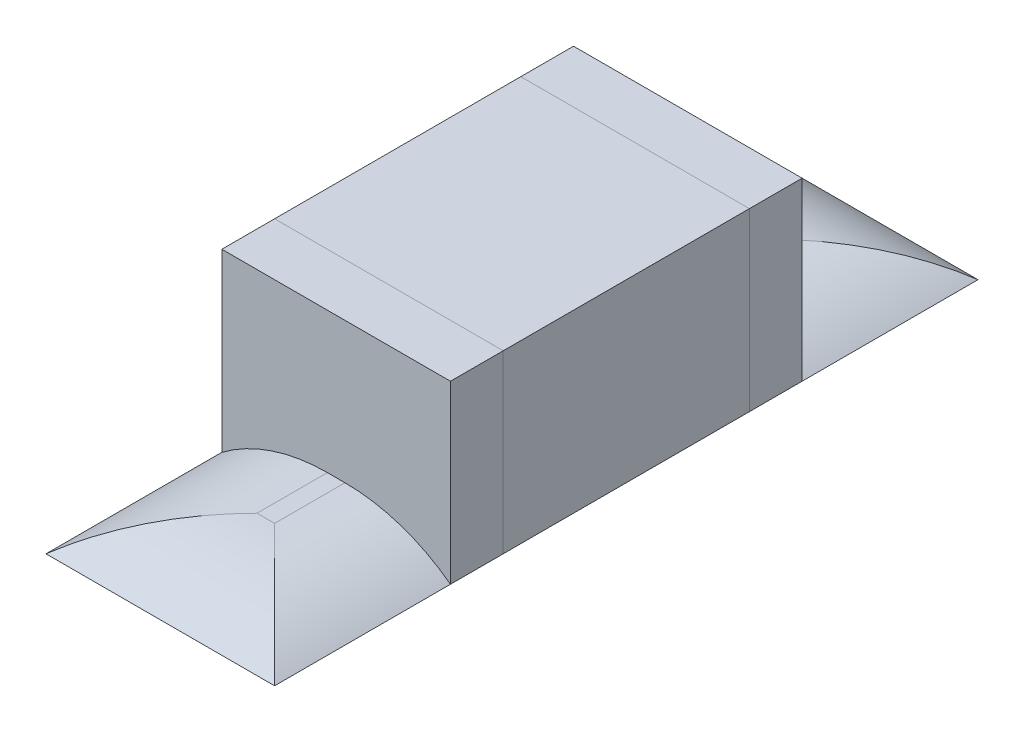
ISO-10303-21;
HEADER;
FILE_DESCRIPTION(('STEP AP214'),'2;1');
FILE_NAME('part.step','',(''),(''),'','','');
FILE_SCHEMA(('AUTOMOTIVE_DESIGN { 1 0 10303 214 1 1 1 1 }'));
ENDSEC;
DATA;
#1=APPLICATION_CONTEXT('core data for automotive mechanical design processes');
#2=APPLICATION_PROTOCOL_DEFINITION('international standard','automotive_design',2000,#1);
#3=PRODUCT_CONTEXT('',#1,'mechanical');
#4=PRODUCT('Part','Part','',(#3));
#5=PRODUCT_RELATED_PRODUCT_CATEGORY('part','',(#4));
#6=PRODUCT_DEFINITION_FORMATION('','',#4);
#7=PRODUCT_DEFINITION_CONTEXT('part definition',#1,'design');
#8=PRODUCT_DEFINITION('design','',#6,#7);
#9=PRODUCT_DEFINITION_SHAPE('','',#8);
#10=(LENGTH_UNIT() NAMED_UNIT(*) SI_UNIT(.MILLI.,.METRE.));
#11=(NAMED_UNIT(*) PLANE_ANGLE_UNIT() SI_UNIT($,.RADIAN.));
#12=(NAMED_UNIT(*) SI_UNIT($,.STERADIAN.) SOLID_ANGLE_UNIT());
#13=UNCERTAINTY_MEASURE_WITH_UNIT(LENGTH_MEASURE(1.E-05),#10,'distance_accuracy_value','');
#14=(GEOMETRIC_REPRESENTATION_CONTEXT(3) GLOBAL_UNCERTAINTY_ASSIGNED_CONTEXT((#13)) GLOBAL_UNIT_ASSIGNED_CONTEXT((#10,
#11,#12)) REPRESENTATION_CONTEXT('',''));
#15=CARTESIAN_POINT('',(0.,0.,0.));
#16=DIRECTION('',(0.,0.,1.));
#17=DIRECTION('',(1.,0.,0.));
#18=AXIS2_PLACEMENT_3D('',#15,#16,#17);
#19=CARTESIAN_POINT('',(15.65,0.2,29.));
#20=DIRECTION('',(0.,-1.,0.));
#21=DIRECTION('',(0.,0.,-1.));
#22=AXIS2_PLACEMENT_3D('',#19,#20,#21);
#23=PLANE('',#22);
#24=DIRECTION('',(1.,0.,0.));
#25=VECTOR('',#24,1.);
#26=CARTESIAN_POINT('',(16.3,0.2,27.6));
#27=LINE('',#26,#25);
#28=CARTESIAN_POINT('',(15.6,0.2,27.6));
#29=VERTEX_POINT('',#28);
#30=CARTESIAN_POINT('',(15.7,0.2,27.6));
#31=VERTEX_POINT('',#30);
#32=EDGE_CURVE('P0_E74',#29,#31,#27,.T.);
#33=ORIENTED_EDGE('',*,*,#32,.F.);
#34=DIRECTION('',(0.,0.,-1.));
#35=VECTOR('',#34,1.);
#36=CARTESIAN_POINT('',(15.6,0.2,27.));
#37=LINE('',#36,#35);
#38=CARTESIAN_POINT('',(15.6,0.2,28.));
#39=VERTEX_POINT('',#38);
#40=EDGE_CURVE('P0_E66',#39,#29,#37,.T.);
#41=ORIENTED_EDGE('',*,*,#40,.F.);
#42=DIRECTION('',(1.,0.,0.));
#43=VECTOR('',#42,1.);
#44=CARTESIAN_POINT('',(15.,0.2,28.));
#45=LINE('',#44,#43);
#46=CARTESIAN_POINT('',(15.7,0.2,28.));
#47=VERTEX_POINT('',#46);
#48=EDGE_CURVE('P0_E62',#47,#39,#45,.F.);
#49=ORIENTED_EDGE('',*,*,#48,.F.);
#50=DIRECTION('',(0.,0.,1.));
#51=VECTOR('',#50,1.);
#52=CARTESIAN_POINT('',(15.7,0.2,28.));
#53=LINE('',#52,#51);
#54=EDGE_CURVE('P0_E65',#31,#47,#53,.T.);
#55=ORIENTED_EDGE('',*,*,#54,.F.);
#56=EDGE_LOOP('',(#33,#41,#49,#55));
#57=FACE_BOUND('',#56,.T.);
#58=ADVANCED_FACE('P0_F16',(#57),#23,.F.);
#59=CARTESIAN_POINT('',(15.,0.,28.));
#60=DIRECTION('',(0.,0.,1.));
#61=DIRECTION('',(1.,0.,0.));
#62=AXIS2_PLACEMENT_3D('',#59,#60,#61);
#63=PLANE('',#62);
#64=CARTESIAN_POINT('',(15.6,-0.8,28.));
#65=DIRECTION('',(0.,0.,-1.));
#66=DIRECTION('',(-1.,0.,0.));
#67=AXIS2_PLACEMENT_3D('',#64,#65,#66);
#68=CIRCLE('',#67,1.);
#69=CARTESIAN_POINT('',(15.,0.,28.));
#70=VERTEX_POINT('',#69);
#71=EDGE_CURVE('P0_E19',#70,#39,#68,.T.);
#72=ORIENTED_EDGE('',*,*,#71,.F.);
#73=DIRECTION('',(1.,0.,0.));
#74=VECTOR('',#73,1.);
#75=CARTESIAN_POINT('',(15.65,0.,28.));
#76=LINE('',#75,#74);
#77=CARTESIAN_POINT('',(16.3,0.,28.));
#78=VERTEX_POINT('',#77);
#79=EDGE_CURVE('P0_E56',#78,#70,#76,.F.);
#80=ORIENTED_EDGE('',*,*,#79,.F.);
#81=CARTESIAN_POINT('',(15.7,-0.8,28.));
#82=DIRECTION('',(0.,0.,1.));
#83=DIRECTION('',(1.,0.,0.));
#84=AXIS2_PLACEMENT_3D('',#81,#82,#83);
#85=CIRCLE('',#84,1.);
#86=EDGE_CURVE('P0_E68',#47,#78,#85,.F.);
#87=ORIENTED_EDGE('',*,*,#86,.F.);
#88=ORIENTED_EDGE('',*,*,#48,.T.);
#89=EDGE_LOOP('',(#72,#80,#87,#88));
#90=FACE_BOUND('',#89,.T.);
#91=ADVANCED_FACE('P0_F69',(#90),#63,.T.);
#92=CARTESIAN_POINT('',(15.6,-0.8,27.));
#93=DIRECTION('',(0.,0.,-1.));
#94=DIRECTION('',(-1.,0.,0.));
#95=AXIS2_PLACEMENT_3D('',#92,#93,#94);
#96=CYLINDRICAL_SURFACE('',#95,1.);
#97=ORIENTED_EDGE('',*,*,#71,.T.);
#98=ORIENTED_EDGE('',*,*,#40,.T.);
#99=CARTESIAN_POINT('',(15.6,-0.8,27.6));
#100=DIRECTION('',(0.707106781186547,0.,-0.707106781186547));
#101=DIRECTION('',(0.707106781186547,0.,0.707106781186547));
#102=AXIS2_PLACEMENT_3D('',#99,#100,#101);
#103=ELLIPSE('',#102,1.41421356237309,1.);
#104=CARTESIAN_POINT('',(15.,0.,27.));
#105=VERTEX_POINT('',#104);
#106=EDGE_CURVE('P0_E82',#105,#29,#103,.T.);
#107=ORIENTED_EDGE('',*,*,#106,.F.);
#108=DIRECTION('',(0.,0.,-1.));
#109=VECTOR('',#108,1.);
#110=CARTESIAN_POINT('',(15.,0.,29.));
#111=LINE('',#110,#109);
#112=EDGE_CURVE('P0_E78',#70,#105,#111,.T.);
#113=ORIENTED_EDGE('',*,*,#112,.F.);
#114=EDGE_LOOP('',(#97,#98,#107,#113));
#115=FACE_BOUND('',#114,.T.);
#116=ADVANCED_FACE('P0_F88',(#115),#96,.T.);
#117=CARTESIAN_POINT('',(16.3,-0.8,27.6));
#118=DIRECTION('',(1.,0.,0.));
#119=DIRECTION('',(0.,0.,-1.));
#120=AXIS2_PLACEMENT_3D('',#117,#118,#119);
#121=CYLINDRICAL_SURFACE('',#120,1.);
#122=ORIENTED_EDGE('',*,*,#106,.T.);
#123=ORIENTED_EDGE('',*,*,#32,.T.);
#124=CARTESIAN_POINT('',(15.7,-0.8,27.6));
#125=DIRECTION('',(0.707106781186547,0.,0.707106781186547));
#126=DIRECTION('',(-0.707106781186547,0.,0.707106781186547));
#127=AXIS2_PLACEMENT_3D('',#124,#125,#126);
#128=ELLIPSE('',#127,1.41421356237309,1.);
#129=CARTESIAN_POINT('',(16.3,0.,27.));
#130=VERTEX_POINT('',#129);
#131=EDGE_CURVE('P0_E34',#130,#31,#128,.T.);
#132=ORIENTED_EDGE('',*,*,#131,.F.);
#133=DIRECTION('',(1.,0.,0.));
#134=VECTOR('',#133,1.);
#135=CARTESIAN_POINT('',(15.65,0.,27.));
#136=LINE('',#135,#134);
#137=EDGE_CURVE('P0_E25',#105,#130,#136,.T.);
#138=ORIENTED_EDGE('',*,*,#137,.F.);
#139=EDGE_LOOP('',(#122,#123,#132,#138));
#140=FACE_BOUND('',#139,.T.);
#141=ADVANCED_FACE('P0_F86',(#140),#121,.T.);
#142=CARTESIAN_POINT('',(15.7,-0.8,28.));
#143=DIRECTION('',(0.,0.,1.));
#144=DIRECTION('',(1.,0.,0.));
#145=AXIS2_PLACEMENT_3D('',#142,#143,#144);
#146=CYLINDRICAL_SURFACE('',#145,1.);
#147=ORIENTED_EDGE('',*,*,#86,.T.);
#148=DIRECTION('',(0.,0.,-1.));
#149=VECTOR('',#148,1.);
#150=CARTESIAN_POINT('',(16.3,0.,29.));
#151=LINE('',#150,#149);
#152=EDGE_CURVE('P0_E11',#130,#78,#151,.F.);
#153=ORIENTED_EDGE('',*,*,#152,.F.);
#154=ORIENTED_EDGE('',*,*,#131,.T.);
#155=ORIENTED_EDGE('',*,*,#54,.T.);
#156=EDGE_LOOP('',(#147,#153,#154,#155));
#157=FACE_BOUND('',#156,.T.);
#158=ADVANCED_FACE('P0_F72',(#157),#146,.T.);
#159=CARTESIAN_POINT('',(15.65,0.,29.));
#160=DIRECTION('',(0.,-1.,0.));
#161=DIRECTION('',(0.,0.,-1.));
#162=AXIS2_PLACEMENT_3D('',#159,#160,#161);
#163=PLANE('',#162);
#164=ORIENTED_EDGE('',*,*,#137,.T.);
#165=ORIENTED_EDGE('',*,*,#152,.T.);
#166=ORIENTED_EDGE('',*,*,#79,.T.);
#167=ORIENTED_EDGE('',*,*,#112,.T.);
#168=EDGE_LOOP('',(#164,#165,#166,#167));
#169=FACE_BOUND('',#168,.T.);
#170=ADVANCED_FACE('P0_F90',(#169),#163,.T.);
#171=CLOSED_SHELL('',(#58,#91,#116,#141,#158,#170));
#172=MANIFOLD_SOLID_BREP('P0_B1',#171);
#173=CARTESIAN_POINT('',(15.,0.,29.7));
#174=DIRECTION('',(0.,0.,1.));
#175=DIRECTION('',(1.,0.,0.));
#176=AXIS2_PLACEMENT_3D('',#173,#174,#175);
#177=PLANE('',#176);
#178=DIRECTION('',(0.,1.,0.));
#179=VECTOR('',#178,1.);
#180=CARTESIAN_POINT('',(15.,0.,29.7));
#181=LINE('',#180,#179);
#182=CARTESIAN_POINT('',(15.,1.,29.7));
#183=VERTEX_POINT('',#182);
#184=CARTESIAN_POINT('',(15.,0.,29.7));
#185=VERTEX_POINT('',#184);
#186=EDGE_CURVE('P1_E79',#183,#185,#181,.F.);
#187=ORIENTED_EDGE('',*,*,#186,.F.);
#188=DIRECTION('',(1.,0.,0.));
#189=VECTOR('',#188,1.);
#190=CARTESIAN_POINT('',(15.,1.,29.7));
#191=LINE('',#190,#189);
#192=CARTESIAN_POINT('',(16.3,1.,29.7));
#193=VERTEX_POINT('',#192);
#194=EDGE_CURVE('P1_E67',#193,#183,#191,.F.);
#195=ORIENTED_EDGE('',*,*,#194,.F.);
#196=DIRECTION('',(0.,1.,0.));
#197=VECTOR('',#196,1.);
#198=CARTESIAN_POINT('',(16.3,1.,29.7));
#199=LINE('',#198,#197);
#200=CARTESIAN_POINT('',(16.3,0.,29.7));
#201=VERTEX_POINT('',#200);
#202=EDGE_CURVE('P1_E54',#201,#193,#199,.T.);
#203=ORIENTED_EDGE('',*,*,#202,.F.);
#204=DIRECTION('',(1.,0.,0.));
#205=VECTOR('',#204,1.);
#206=CARTESIAN_POINT('',(16.3,0.,29.7));
#207=LINE('',#206,#205);
#208=EDGE_CURVE('P1_E19',#185,#201,#207,.T.);
#209=ORIENTED_EDGE('',*,*,#208,.F.);
#210=EDGE_LOOP('',(#187,#195,#203,#209));
#211=FACE_BOUND('',#210,.T.);
#212=ADVANCED_FACE('P1_F16',(#211),#177,.F.);
#213=CARTESIAN_POINT('',(16.3,0.,30.));
#214=DIRECTION('',(0.,-1.,0.));
#215=DIRECTION('',(0.,0.,-1.));
#216=AXIS2_PLACEMENT_3D('',#213,#214,#215);
#217=PLANE('',#216);
#218=ORIENTED_EDGE('',*,*,#208,.T.);
#219=DIRECTION('',(0.,0.,-1.));
#220=VECTOR('',#219,1.);
#221=CARTESIAN_POINT('',(16.3,0.,30.));
#222=LINE('',#221,#220);
#223=CARTESIAN_POINT('',(16.3,0.,30.));
#224=VERTEX_POINT('',#223);
#225=EDGE_CURVE('P1_E60',#224,#201,#222,.T.);
#226=ORIENTED_EDGE('',*,*,#225,.F.);
#227=DIRECTION('',(1.,0.,0.));
#228=VECTOR('',#227,1.);
#229=CARTESIAN_POINT('',(15.,0.,30.));
#230=LINE('',#229,#228);
#231=CARTESIAN_POINT('',(15.,0.,30.));
#232=VERTEX_POINT('',#231);
#233=EDGE_CURVE('P1_E82',#232,#224,#230,.T.);
#234=ORIENTED_EDGE('',*,*,#233,.F.);
#235=DIRECTION('',(0.,0.,1.));
#236=VECTOR('',#235,1.);
#237=CARTESIAN_POINT('',(15.,0.,30.));
#238=LINE('',#237,#236);
#239=EDGE_CURVE('P1_E63',#185,#232,#238,.T.);
#240=ORIENTED_EDGE('',*,*,#239,.F.);
#241=EDGE_LOOP('',(#218,#226,#234,#240));
#242=FACE_BOUND('',#241,.T.);
#243=ADVANCED_FACE('P1_F59',(#242),#217,.T.);
#244=CARTESIAN_POINT('',(16.3,1.,30.));
#245=DIRECTION('',(1.,0.,0.));
#246=DIRECTION('',(0.,0.,-1.));
#247=AXIS2_PLACEMENT_3D('',#244,#245,#246);
#248=PLANE('',#247);
#249=ORIENTED_EDGE('',*,*,#202,.T.);
#250=DIRECTION('',(0.,0.,1.));
#251=VECTOR('',#250,1.);
#252=CARTESIAN_POINT('',(16.3,1.,30.));
#253=LINE('',#252,#251);
#254=CARTESIAN_POINT('',(16.3,1.,30.));
#255=VERTEX_POINT('',#254);
#256=EDGE_CURVE('P1_E69',#255,#193,#253,.F.);
#257=ORIENTED_EDGE('',*,*,#256,.F.);
#258=DIRECTION('',(0.,1.,0.));
#259=VECTOR('',#258,1.);
#260=CARTESIAN_POINT('',(16.3,0.,30.));
#261=LINE('',#260,#259);
#262=EDGE_CURVE('P1_E73',#224,#255,#261,.T.);
#263=ORIENTED_EDGE('',*,*,#262,.F.);
#264=ORIENTED_EDGE('',*,*,#225,.T.);
#265=EDGE_LOOP('',(#249,#257,#263,#264));
#266=FACE_BOUND('',#265,.T.);
#267=ADVANCED_FACE('P1_F71',(#266),#248,.T.);
#268=CARTESIAN_POINT('',(15.,1.,30.));
#269=DIRECTION('',(0.,1.,0.));
#270=DIRECTION('',(0.,0.,1.));
#271=AXIS2_PLACEMENT_3D('',#268,#269,#270);
#272=PLANE('',#271);
#273=ORIENTED_EDGE('',*,*,#194,.T.);
#274=DIRECTION('',(0.,0.,1.));
#275=VECTOR('',#274,1.);
#276=CARTESIAN_POINT('',(15.,1.,30.));
#277=LINE('',#276,#275);
#278=CARTESIAN_POINT('',(15.,1.,30.));
#279=VERTEX_POINT('',#278);
#280=EDGE_CURVE('P1_E34',#279,#183,#277,.F.);
#281=ORIENTED_EDGE('',*,*,#280,.F.);
#282=DIRECTION('',(1.,0.,0.));
#283=VECTOR('',#282,1.);
#284=CARTESIAN_POINT('',(15.,1.,30.));
#285=LINE('',#284,#283);
#286=EDGE_CURVE('P1_E25',#255,#279,#285,.F.);
#287=ORIENTED_EDGE('',*,*,#286,.F.);
#288=ORIENTED_EDGE('',*,*,#256,.T.);
#289=EDGE_LOOP('',(#273,#281,#287,#288));
#290=FACE_BOUND('',#289,.T.);
#291=ADVANCED_FACE('P1_F88',(#290),#272,.T.);
#292=CARTESIAN_POINT('',(15.,0.,30.));
#293=DIRECTION('',(-1.,0.,0.));
#294=DIRECTION('',(0.,0.,1.));
#295=AXIS2_PLACEMENT_3D('',#292,#293,#294);
#296=PLANE('',#295);
#297=ORIENTED_EDGE('',*,*,#186,.T.);
#298=ORIENTED_EDGE('',*,*,#239,.T.);
#299=DIRECTION('',(0.,1.,0.));
#300=VECTOR('',#299,1.);
#301=CARTESIAN_POINT('',(15.,0.,30.));
#302=LINE('',#301,#300);
#303=EDGE_CURVE('P1_E11',#279,#232,#302,.F.);
#304=ORIENTED_EDGE('',*,*,#303,.F.);
#305=ORIENTED_EDGE('',*,*,#280,.T.);
#306=EDGE_LOOP('',(#297,#298,#304,#305));
#307=FACE_BOUND('',#306,.T.);
#308=ADVANCED_FACE('P1_F90',(#307),#296,.T.);
#309=CARTESIAN_POINT('',(15.,0.,30.));
#310=DIRECTION('',(0.,0.,1.));
#311=DIRECTION('',(1.,0.,0.));
#312=AXIS2_PLACEMENT_3D('',#309,#310,#311);
#313=PLANE('',#312);
#314=ORIENTED_EDGE('',*,*,#286,.T.);
#315=ORIENTED_EDGE('',*,*,#303,.T.);
#316=ORIENTED_EDGE('',*,*,#233,.T.);
#317=ORIENTED_EDGE('',*,*,#262,.T.);
#318=EDGE_LOOP('',(#314,#315,#316,#317));
#319=FACE_BOUND('',#318,.T.);
#320=ADVANCED_FACE('P1_F87',(#319),#313,.T.);
#321=CLOSED_SHELL('',(#212,#243,#267,#291,#308,#320));
#322=MANIFOLD_SOLID_BREP('P1_B1',#321);
#323=CARTESIAN_POINT('',(15.65,0.,28.7));
#324=DIRECTION('',(0.,1.,0.));
#325=DIRECTION('',(0.,0.,1.));
#326=AXIS2_PLACEMENT_3D('',#323,#324,#325);
#327=PLANE('',#326);
#328=DIRECTION('',(0.,0.,1.));
#329=VECTOR('',#328,1.);
#330=CARTESIAN_POINT('',(15.,0.,27.7));
#331=LINE('',#330,#329);
#332=CARTESIAN_POINT('',(15.,0.,28.3));
#333=VERTEX_POINT('',#332);
#334=CARTESIAN_POINT('',(15.,0.,29.7));
#335=VERTEX_POINT('',#334);
#336=EDGE_CURVE('P2_E78',#333,#335,#331,.T.);
#337=ORIENTED_EDGE('',*,*,#336,.F.);
#338=DIRECTION('',(-1.,0.,0.));
#339=VECTOR('',#338,1.);
#340=CARTESIAN_POINT('',(16.3,0.,28.3));
#341=LINE('',#340,#339);
#342=CARTESIAN_POINT('',(16.3,0.,28.3));
#343=VERTEX_POINT('',#342);
#344=EDGE_CURVE('P2_E54',#343,#333,#341,.T.);
#345=ORIENTED_EDGE('',*,*,#344,.F.);
#346=DIRECTION('',(0.,0.,-1.));
#347=VECTOR('',#346,1.);
#348=CARTESIAN_POINT('',(16.3,0.,29.7));
#349=LINE('',#348,#347);
#350=CARTESIAN_POINT('',(16.3,0.,29.7));
#351=VERTEX_POINT('',#350);
#352=EDGE_CURVE('P2_E56',#351,#343,#349,.T.);
#353=ORIENTED_EDGE('',*,*,#352,.F.);
#354=DIRECTION('',(1.,0.,0.));
#355=VECTOR('',#354,1.);
#356=CARTESIAN_POINT('',(15.,0.,29.7));
#357=LINE('',#356,#355);
#358=EDGE_CURVE('P2_E19',#335,#351,#357,.T.);
#359=ORIENTED_EDGE('',*,*,#358,.F.);
#360=EDGE_LOOP('',(#337,#345,#353,#359));
#361=FACE_BOUND('',#360,.T.);
#362=ADVANCED_FACE('P2_F16',(#361),#327,.F.);
#363=CARTESIAN_POINT('',(15.,0.,29.7));
#364=DIRECTION('',(0.,0.,1.));
#365=DIRECTION('',(1.,0.,0.));
#366=AXIS2_PLACEMENT_3D('',#363,#364,#365);
#367=PLANE('',#366);
#368=DIRECTION('',(1.,0.,0.));
#369=VECTOR('',#368,1.);
#370=CARTESIAN_POINT('',(15.65,1.,29.7));
#371=LINE('',#370,#369);
#372=CARTESIAN_POINT('',(15.,1.,29.7));
#373=VERTEX_POINT('',#372);
#374=CARTESIAN_POINT('',(16.3,1.,29.7));
#375=VERTEX_POINT('',#374);
#376=EDGE_CURVE('P2_E82',#373,#375,#371,.T.);
#377=ORIENTED_EDGE('',*,*,#376,.F.);
#378=DIRECTION('',(0.,1.,0.));
#379=VECTOR('',#378,1.);
#380=CARTESIAN_POINT('',(15.,0.,29.7));
#381=LINE('',#380,#379);
#382=EDGE_CURVE('P2_E67',#335,#373,#381,.T.);
#383=ORIENTED_EDGE('',*,*,#382,.F.);
#384=ORIENTED_EDGE('',*,*,#358,.T.);
#385=DIRECTION('',(0.,1.,0.));
#386=VECTOR('',#385,1.);
#387=CARTESIAN_POINT('',(16.3,0.,29.7));
#388=LINE('',#387,#386);
#389=EDGE_CURVE('P2_E62',#375,#351,#388,.F.);
#390=ORIENTED_EDGE('',*,*,#389,.F.);
#391=EDGE_LOOP('',(#377,#383,#384,#390));
#392=FACE_BOUND('',#391,.T.);
#393=ADVANCED_FACE('P2_F64',(#392),#367,.T.);
#394=CARTESIAN_POINT('',(16.3,0.,29.7));
#395=DIRECTION('',(1.,0.,0.));
#396=DIRECTION('',(0.,0.,-1.));
#397=AXIS2_PLACEMENT_3D('',#394,#395,#396);
#398=PLANE('',#397);
#399=DIRECTION('',(0.,0.,1.));
#400=VECTOR('',#399,1.);
#401=CARTESIAN_POINT('',(16.3,1.,28.7));
#402=LINE('',#401,#400);
#403=CARTESIAN_POINT('',(16.3,1.,28.3));
#404=VERTEX_POINT('',#403);
#405=EDGE_CURVE('P2_E71',#375,#404,#402,.F.);
#406=ORIENTED_EDGE('',*,*,#405,.F.);
#407=ORIENTED_EDGE('',*,*,#389,.T.);
#408=ORIENTED_EDGE('',*,*,#352,.T.);
#409=DIRECTION('',(0.,1.,0.));
#410=VECTOR('',#409,1.);
#411=CARTESIAN_POINT('',(16.3,0.,28.3));
#412=LINE('',#411,#410);
#413=EDGE_CURVE('P2_E74',#404,#343,#412,.F.);
#414=ORIENTED_EDGE('',*,*,#413,.F.);
#415=EDGE_LOOP('',(#406,#407,#408,#414));
#416=FACE_BOUND('',#415,.T.);
#417=ADVANCED_FACE('P2_F69',(#416),#398,.T.);
#418=CARTESIAN_POINT('',(16.3,0.,28.3));
#419=DIRECTION('',(0.,0.,-1.));
#420=DIRECTION('',(-1.,0.,0.));
#421=AXIS2_PLACEMENT_3D('',#418,#419,#420);
#422=PLANE('',#421);
#423=DIRECTION('',(1.,0.,0.));
#424=VECTOR('',#423,1.);
#425=CARTESIAN_POINT('',(15.65,1.,28.3));
#426=LINE('',#425,#424);
#427=CARTESIAN_POINT('',(15.,1.,28.3));
#428=VERTEX_POINT('',#427);
#429=EDGE_CURVE('P2_E25',#404,#428,#426,.F.);
#430=ORIENTED_EDGE('',*,*,#429,.F.);
#431=ORIENTED_EDGE('',*,*,#413,.T.);
#432=ORIENTED_EDGE('',*,*,#344,.T.);
#433=DIRECTION('',(0.,1.,0.));
#434=VECTOR('',#433,1.);
#435=CARTESIAN_POINT('',(15.,0.,28.3));
#436=LINE('',#435,#434);
#437=EDGE_CURVE('P2_E34',#428,#333,#436,.F.);
#438=ORIENTED_EDGE('',*,*,#437,.F.);
#439=EDGE_LOOP('',(#430,#431,#432,#438));
#440=FACE_BOUND('',#439,.T.);
#441=ADVANCED_FACE('P2_F88',(#440),#422,.T.);
#442=CARTESIAN_POINT('',(15.,0.,27.7));
#443=DIRECTION('',(-1.,0.,0.));
#444=DIRECTION('',(0.,0.,1.));
#445=AXIS2_PLACEMENT_3D('',#442,#443,#444);
#446=PLANE('',#445);
#447=DIRECTION('',(0.,0.,1.));
#448=VECTOR('',#447,1.);
#449=CARTESIAN_POINT('',(15.,1.,28.7));
#450=LINE('',#449,#448);
#451=EDGE_CURVE('P2_E11',#428,#373,#450,.T.);
#452=ORIENTED_EDGE('',*,*,#451,.F.);
#453=ORIENTED_EDGE('',*,*,#437,.T.);
#454=ORIENTED_EDGE('',*,*,#336,.T.);
#455=ORIENTED_EDGE('',*,*,#382,.T.);
#456=EDGE_LOOP('',(#452,#453,#454,#455));
#457=FACE_BOUND('',#456,.T.);
#458=ADVANCED_FACE('P2_F90',(#457),#446,.T.);
#459=CARTESIAN_POINT('',(15.65,1.,28.7));
#460=DIRECTION('',(0.,1.,0.));
#461=DIRECTION('',(0.,0.,1.));
#462=AXIS2_PLACEMENT_3D('',#459,#460,#461);
#463=PLANE('',#462);
#464=ORIENTED_EDGE('',*,*,#429,.T.);
#465=ORIENTED_EDGE('',*,*,#451,.T.);
#466=ORIENTED_EDGE('',*,*,#376,.T.);
#467=ORIENTED_EDGE('',*,*,#405,.T.);
#468=EDGE_LOOP('',(#464,#465,#466,#467));
#469=FACE_BOUND('',#468,.T.);
#470=ADVANCED_FACE('P2_F87',(#469),#463,.T.);
#471=CLOSED_SHELL('',(#362,#393,#417,#441,#458,#470));
#472=MANIFOLD_SOLID_BREP('P2_B1',#471);
#473=CARTESIAN_POINT('',(16.3,0.,28.3));
#474=DIRECTION('',(0.,0.,-1.));
#475=DIRECTION('',(-1.,0.,0.));
#476=AXIS2_PLACEMENT_3D('',#473,#474,#475);
#477=PLANE('',#476);
#478=DIRECTION('',(0.,1.,0.));
#479=VECTOR('',#478,1.);
#480=CARTESIAN_POINT('',(16.3,1.,28.3));
#481=LINE('',#480,#479);
#482=CARTESIAN_POINT('',(16.3,1.,28.3));
#483=VERTEX_POINT('',#482);
#484=CARTESIAN_POINT('',(16.3,0.,28.3));
#485=VERTEX_POINT('',#484);
#486=EDGE_CURVE('P3_E78',#483,#485,#481,.F.);
#487=ORIENTED_EDGE('',*,*,#486,.F.);
#488=DIRECTION('',(1.,0.,0.));
#489=VECTOR('',#488,1.);
#490=CARTESIAN_POINT('',(15.,1.,28.3));
#491=LINE('',#490,#489);
#492=CARTESIAN_POINT('',(15.,1.,28.3));
#493=VERTEX_POINT('',#492);
#494=EDGE_CURVE('P3_E54',#493,#483,#491,.T.);
#495=ORIENTED_EDGE('',*,*,#494,.F.);
#496=DIRECTION('',(0.,1.,0.));
#497=VECTOR('',#496,1.);
#498=CARTESIAN_POINT('',(15.,0.,28.3));
#499=LINE('',#498,#497);
#500=CARTESIAN_POINT('',(15.,0.,28.3));
#501=VERTEX_POINT('',#500);
#502=EDGE_CURVE('P3_E56',#501,#493,#499,.T.);
#503=ORIENTED_EDGE('',*,*,#502,.F.);
#504=DIRECTION('',(1.,0.,0.));
#505=VECTOR('',#504,1.);
#506=CARTESIAN_POINT('',(16.3,0.,28.3));
#507=LINE('',#506,#505);
#508=EDGE_CURVE('P3_E19',#485,#501,#507,.F.);
#509=ORIENTED_EDGE('',*,*,#508,.F.);
#510=EDGE_LOOP('',(#487,#495,#503,#509));
#511=FACE_BOUND('',#510,.T.);
#512=ADVANCED_FACE('P3_F16',(#511),#477,.F.);
#513=CARTESIAN_POINT('',(16.3,0.,28.3));
#514=DIRECTION('',(0.,-1.,0.));
#515=DIRECTION('',(0.,0.,-1.));
#516=AXIS2_PLACEMENT_3D('',#513,#514,#515);
#517=PLANE('',#516);
#518=DIRECTION('',(-1.,0.,0.));
#519=VECTOR('',#518,1.);
#520=CARTESIAN_POINT('',(16.3,0.,28.));
#521=LINE('',#520,#519);
#522=CARTESIAN_POINT('',(16.3,0.,28.));
#523=VERTEX_POINT('',#522);
#524=CARTESIAN_POINT('',(15.,0.,28.));
#525=VERTEX_POINT('',#524);
#526=EDGE_CURVE('P3_E82',#523,#525,#521,.T.);
#527=ORIENTED_EDGE('',*,*,#526,.F.);
#528=DIRECTION('',(0.,0.,-1.));
#529=VECTOR('',#528,1.);
#530=CARTESIAN_POINT('',(16.3,0.,28.3));
#531=LINE('',#530,#529);
#532=EDGE_CURVE('P3_E67',#485,#523,#531,.T.);
#533=ORIENTED_EDGE('',*,*,#532,.F.);
#534=ORIENTED_EDGE('',*,*,#508,.T.);
#535=DIRECTION('',(0.,0.,1.));
#536=VECTOR('',#535,1.);
#537=CARTESIAN_POINT('',(15.,0.,28.3));
#538=LINE('',#537,#536);
#539=EDGE_CURVE('P3_E62',#525,#501,#538,.T.);
#540=ORIENTED_EDGE('',*,*,#539,.F.);
#541=EDGE_LOOP('',(#527,#533,#534,#540));
#542=FACE_BOUND('',#541,.T.);
#543=ADVANCED_FACE('P3_F64',(#542),#517,.T.);
#544=CARTESIAN_POINT('',(15.,0.,28.3));
#545=DIRECTION('',(-1.,0.,0.));
#546=DIRECTION('',(0.,0.,1.));
#547=AXIS2_PLACEMENT_3D('',#544,#545,#546);
#548=PLANE('',#547);
#549=DIRECTION('',(0.,1.,0.));
#550=VECTOR('',#549,1.);
#551=CARTESIAN_POINT('',(15.,0.,28.));
#552=LINE('',#551,#550);
#553=CARTESIAN_POINT('',(15.,1.,28.));
#554=VERTEX_POINT('',#553);
#555=EDGE_CURVE('P3_E71',#525,#554,#552,.T.);
#556=ORIENTED_EDGE('',*,*,#555,.F.);
#557=ORIENTED_EDGE('',*,*,#539,.T.);
#558=ORIENTED_EDGE('',*,*,#502,.T.);
#559=DIRECTION('',(0.,0.,1.));
#560=VECTOR('',#559,1.);
#561=CARTESIAN_POINT('',(15.,1.,28.3));
#562=LINE('',#561,#560);
#563=EDGE_CURVE('P3_E74',#554,#493,#562,.T.);
#564=ORIENTED_EDGE('',*,*,#563,.F.);
#565=EDGE_LOOP('',(#556,#557,#558,#564));
#566=FACE_BOUND('',#565,.T.);
#567=ADVANCED_FACE('P3_F69',(#566),#548,.T.);
#568=CARTESIAN_POINT('',(15.,1.,28.3));
#569=DIRECTION('',(0.,1.,0.));
#570=DIRECTION('',(0.,0.,1.));
#571=AXIS2_PLACEMENT_3D('',#568,#569,#570);
#572=PLANE('',#571);
#573=DIRECTION('',(-1.,0.,0.));
#574=VECTOR('',#573,1.);
#575=CARTESIAN_POINT('',(16.3,1.,28.));
#576=LINE('',#575,#574);
#577=CARTESIAN_POINT('',(16.3,1.,28.));
#578=VERTEX_POINT('',#577);
#579=EDGE_CURVE('P3_E25',#554,#578,#576,.F.);
#580=ORIENTED_EDGE('',*,*,#579,.F.);
#581=ORIENTED_EDGE('',*,*,#563,.T.);
#582=ORIENTED_EDGE('',*,*,#494,.T.);
#583=DIRECTION('',(0.,0.,-1.));
#584=VECTOR('',#583,1.);
#585=CARTESIAN_POINT('',(16.3,1.,28.3));
#586=LINE('',#585,#584);
#587=EDGE_CURVE('P3_E34',#578,#483,#586,.F.);
#588=ORIENTED_EDGE('',*,*,#587,.F.);
#589=EDGE_LOOP('',(#580,#581,#582,#588));
#590=FACE_BOUND('',#589,.T.);
#591=ADVANCED_FACE('P3_F88',(#590),#572,.T.);
#592=CARTESIAN_POINT('',(16.3,1.,28.3));
#593=DIRECTION('',(1.,0.,0.));
#594=DIRECTION('',(0.,0.,-1.));
#595=AXIS2_PLACEMENT_3D('',#592,#593,#594);
#596=PLANE('',#595);
#597=DIRECTION('',(0.,1.,0.));
#598=VECTOR('',#597,1.);
#599=CARTESIAN_POINT('',(16.3,0.,28.));
#600=LINE('',#599,#598);
#601=EDGE_CURVE('P3_E11',#578,#523,#600,.F.);
#602=ORIENTED_EDGE('',*,*,#601,.F.);
#603=ORIENTED_EDGE('',*,*,#587,.T.);
#604=ORIENTED_EDGE('',*,*,#486,.T.);
#605=ORIENTED_EDGE('',*,*,#532,.T.);
#606=EDGE_LOOP('',(#602,#603,#604,#605));
#607=FACE_BOUND('',#606,.T.);
#608=ADVANCED_FACE('P3_F90',(#607),#596,.T.);
#609=CARTESIAN_POINT('',(16.3,0.,28.));
#610=DIRECTION('',(0.,0.,-1.));
#611=DIRECTION('',(-1.,0.,0.));
#612=AXIS2_PLACEMENT_3D('',#609,#610,#611);
#613=PLANE('',#612);
#614=ORIENTED_EDGE('',*,*,#579,.T.);
#615=ORIENTED_EDGE('',*,*,#601,.T.);
#616=ORIENTED_EDGE('',*,*,#526,.T.);
#617=ORIENTED_EDGE('',*,*,#555,.T.);
#618=EDGE_LOOP('',(#614,#615,#616,#617));
#619=FACE_BOUND('',#618,.T.);
#620=ADVANCED_FACE('P3_F87',(#619),#613,.T.);
#621=CLOSED_SHELL('',(#512,#543,#567,#591,#608,#620));
#622=MANIFOLD_SOLID_BREP('P3_B1',#621);
#623=CARTESIAN_POINT('',(15.65,0.2,29.));
#624=DIRECTION('',(0.,-1.,0.));
#625=DIRECTION('',(0.,0.,-1.));
#626=AXIS2_PLACEMENT_3D('',#623,#624,#625);
#627=PLANE('',#626);
#628=DIRECTION('',(-1.,0.,0.));
#629=VECTOR('',#628,1.);
#630=CARTESIAN_POINT('',(15.,0.2,30.4));
#631=LINE('',#630,#629);
#632=CARTESIAN_POINT('',(15.7,0.2,30.4));
#633=VERTEX_POINT('',#632);
#634=CARTESIAN_POINT('',(15.6,0.2,30.4));
#635=VERTEX_POINT('',#634);
#636=EDGE_CURVE('P4_E73',#633,#635,#631,.T.);
#637=ORIENTED_EDGE('',*,*,#636,.F.);
#638=DIRECTION('',(0.,0.,1.));
#639=VECTOR('',#638,1.);
#640=CARTESIAN_POINT('',(15.7,0.2,31.));
#641=LINE('',#640,#639);
#642=CARTESIAN_POINT('',(15.7,0.2,30.));
#643=VERTEX_POINT('',#642);
#644=EDGE_CURVE('P4_E79',#643,#633,#641,.T.);
#645=ORIENTED_EDGE('',*,*,#644,.F.);
#646=DIRECTION('',(-1.,0.,0.));
#647=VECTOR('',#646,1.);
#648=CARTESIAN_POINT('',(16.3,0.2,30.));
#649=LINE('',#648,#647);
#650=CARTESIAN_POINT('',(15.6,0.2,30.));
#651=VERTEX_POINT('',#650);
#652=EDGE_CURVE('P4_E63',#651,#643,#649,.F.);
#653=ORIENTED_EDGE('',*,*,#652,.F.);
#654=DIRECTION('',(0.,0.,-1.));
#655=VECTOR('',#654,1.);
#656=CARTESIAN_POINT('',(15.6,0.2,30.));
#657=LINE('',#656,#655);
#658=EDGE_CURVE('P4_E60',#635,#651,#657,.T.);
#659=ORIENTED_EDGE('',*,*,#658,.F.);
#660=EDGE_LOOP('',(#637,#645,#653,#659));
#661=FACE_BOUND('',#660,.T.);
#662=ADVANCED_FACE('P4_F16',(#661),#627,.F.);
#663=CARTESIAN_POINT('',(15.6,-0.8,30.));
#664=DIRECTION('',(0.,0.,-1.));
#665=DIRECTION('',(-1.,0.,0.));
#666=AXIS2_PLACEMENT_3D('',#663,#664,#665);
#667=CYLINDRICAL_SURFACE('',#666,1.);
#668=CARTESIAN_POINT('',(15.6,-0.8,30.));
#669=DIRECTION('',(0.,0.,-1.));
#670=DIRECTION('',(-1.,0.,0.));
#671=AXIS2_PLACEMENT_3D('',#668,#669,#670);
#672=CIRCLE('',#671,1.);
#673=CARTESIAN_POINT('',(15.,0.,30.));
#674=VERTEX_POINT('',#673);
#675=EDGE_CURVE('P4_E19',#674,#651,#672,.T.);
#676=ORIENTED_EDGE('',*,*,#675,.F.);
#677=DIRECTION('',(0.,0.,-1.));
#678=VECTOR('',#677,1.);
#679=CARTESIAN_POINT('',(15.,0.,29.));
#680=LINE('',#679,#678);
#681=CARTESIAN_POINT('',(15.,0.,31.));
#682=VERTEX_POINT('',#681);
#683=EDGE_CURVE('P4_E58',#682,#674,#680,.T.);
#684=ORIENTED_EDGE('',*,*,#683,.F.);
#685=CARTESIAN_POINT('',(15.6,-0.8,30.4));
#686=DIRECTION('',(-0.707106781186547,0.,-0.707106781186547));
#687=DIRECTION('',(-0.707106781186547,0.,0.707106781186547));
#688=AXIS2_PLACEMENT_3D('',#685,#686,#687);
#689=ELLIPSE('',#688,1.41421356237309,1.);
#690=EDGE_CURVE('P4_E80',#635,#682,#689,.F.);
#691=ORIENTED_EDGE('',*,*,#690,.F.);
#692=ORIENTED_EDGE('',*,*,#658,.T.);
#693=EDGE_LOOP('',(#676,#684,#691,#692));
#694=FACE_BOUND('',#693,.T.);
#695=ADVANCED_FACE('P4_F55',(#694),#667,.T.);
#696=CARTESIAN_POINT('',(16.3,0.,30.));
#697=DIRECTION('',(0.,0.,-1.));
#698=DIRECTION('',(-1.,0.,0.));
#699=AXIS2_PLACEMENT_3D('',#696,#697,#698);
#700=PLANE('',#699);
#701=CARTESIAN_POINT('',(15.7,-0.8,30.));
#702=DIRECTION('',(0.,0.,1.));
#703=DIRECTION('',(1.,0.,0.));
#704=AXIS2_PLACEMENT_3D('',#701,#702,#703);
#705=CIRCLE('',#704,1.);
#706=CARTESIAN_POINT('',(16.3,0.,30.));
#707=VERTEX_POINT('',#706);
#708=EDGE_CURVE('P4_E68',#707,#643,#705,.T.);
#709=ORIENTED_EDGE('',*,*,#708,.F.);
#710=DIRECTION('',(1.,0.,0.));
#711=VECTOR('',#710,1.);
#712=CARTESIAN_POINT('',(15.65,0.,30.));
#713=LINE('',#712,#711);
#714=EDGE_CURVE('P4_E65',#674,#707,#713,.T.);
#715=ORIENTED_EDGE('',*,*,#714,.F.);
#716=ORIENTED_EDGE('',*,*,#675,.T.);
#717=ORIENTED_EDGE('',*,*,#652,.T.);
#718=EDGE_LOOP('',(#709,#715,#716,#717));
#719=FACE_BOUND('',#718,.T.);
#720=ADVANCED_FACE('P4_F66',(#719),#700,.T.);
#721=CARTESIAN_POINT('',(15.7,-0.8,31.));
#722=DIRECTION('',(0.,0.,1.));
#723=DIRECTION('',(1.,0.,0.));
#724=AXIS2_PLACEMENT_3D('',#721,#722,#723);
#725=CYLINDRICAL_SURFACE('',#724,1.);
#726=CARTESIAN_POINT('',(15.7,-0.8,30.4));
#727=DIRECTION('',(-0.707106781186547,0.,0.707106781186547));
#728=DIRECTION('',(-0.707106781186547,0.,-0.707106781186547));
#729=AXIS2_PLACEMENT_3D('',#726,#727,#728);
#730=ELLIPSE('',#729,1.41421356237309,1.);
#731=CARTESIAN_POINT('',(16.3,0.,31.));
#732=VERTEX_POINT('',#731);
#733=EDGE_CURVE('P4_E34',#732,#633,#730,.T.);
#734=ORIENTED_EDGE('',*,*,#733,.F.);
#735=DIRECTION('',(0.,0.,-1.));
#736=VECTOR('',#735,1.);
#737=CARTESIAN_POINT('',(16.3,0.,29.));
#738=LINE('',#737,#736);
#739=EDGE_CURVE('P4_E25',#707,#732,#738,.F.);
#740=ORIENTED_EDGE('',*,*,#739,.F.);
#741=ORIENTED_EDGE('',*,*,#708,.T.);
#742=ORIENTED_EDGE('',*,*,#644,.T.);
#743=EDGE_LOOP('',(#734,#740,#741,#742));
#744=FACE_BOUND('',#743,.T.);
#745=ADVANCED_FACE('P4_F85',(#744),#725,.T.);
#746=CARTESIAN_POINT('',(15.,-0.8,30.4));
#747=DIRECTION('',(-1.,0.,0.));
#748=DIRECTION('',(0.,0.,1.));
#749=AXIS2_PLACEMENT_3D('',#746,#747,#748);
#750=CYLINDRICAL_SURFACE('',#749,1.);
#751=ORIENTED_EDGE('',*,*,#733,.T.);
#752=ORIENTED_EDGE('',*,*,#636,.T.);
#753=ORIENTED_EDGE('',*,*,#690,.T.);
#754=DIRECTION('',(1.,0.,0.));
#755=VECTOR('',#754,1.);
#756=CARTESIAN_POINT('',(15.65,0.,31.));
#757=LINE('',#756,#755);
#758=EDGE_CURVE('P4_E11',#732,#682,#757,.F.);
#759=ORIENTED_EDGE('',*,*,#758,.F.);
#760=EDGE_LOOP('',(#751,#752,#753,#759));
#761=FACE_BOUND('',#760,.T.);
#762=ADVANCED_FACE('P4_F90',(#761),#750,.T.);
#763=CARTESIAN_POINT('',(15.65,0.,29.));
#764=DIRECTION('',(0.,-1.,0.));
#765=DIRECTION('',(0.,0.,-1.));
#766=AXIS2_PLACEMENT_3D('',#763,#764,#765);
#767=PLANE('',#766);
#768=ORIENTED_EDGE('',*,*,#739,.T.);
#769=ORIENTED_EDGE('',*,*,#758,.T.);
#770=ORIENTED_EDGE('',*,*,#683,.T.);
#771=ORIENTED_EDGE('',*,*,#714,.T.);
#772=EDGE_LOOP('',(#768,#769,#770,#771));
#773=FACE_BOUND('',#772,.T.);
#774=ADVANCED_FACE('P4_F72',(#773),#767,.T.);
#775=CLOSED_SHELL('',(#662,#695,#720,#745,#762,#774));
#776=MANIFOLD_SOLID_BREP('P4_B1',#775);
#777=ADVANCED_BREP_SHAPE_REPRESENTATION('',(#18,#172,#322,#472,#622,#776),#14);
#778=SHAPE_DEFINITION_REPRESENTATION(#9,#777);
ENDSEC;
END-ISO-10303-21;
